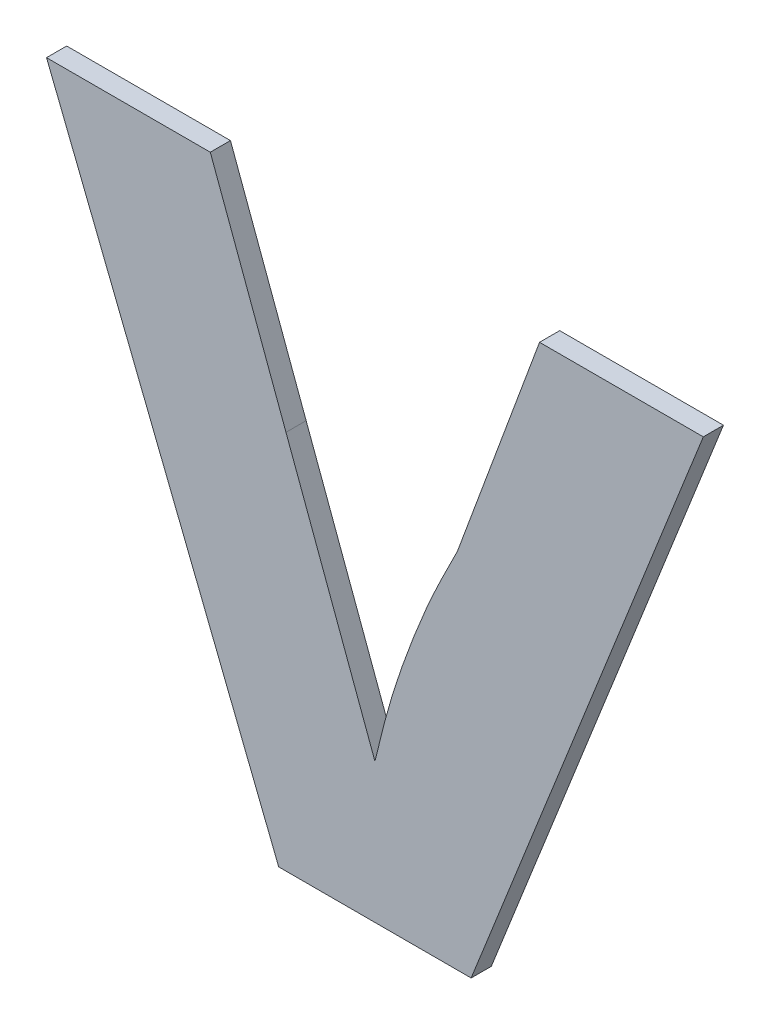
ISO-10303-21;
HEADER;
FILE_DESCRIPTION(('STEP AP214'),'2;1');
FILE_NAME('part.step','',(''),(''),'','','');
FILE_SCHEMA(('AUTOMOTIVE_DESIGN { 1 0 10303 214 1 1 1 1 }'));
ENDSEC;
DATA;
#1=APPLICATION_CONTEXT('core data for automotive mechanical design processes');
#2=APPLICATION_PROTOCOL_DEFINITION('international standard','automotive_design',2000,#1);
#3=PRODUCT_CONTEXT('',#1,'mechanical');
#4=PRODUCT('Part','Part','',(#3));
#5=PRODUCT_RELATED_PRODUCT_CATEGORY('part','',(#4));
#6=PRODUCT_DEFINITION_FORMATION('','',#4);
#7=PRODUCT_DEFINITION_CONTEXT('part definition',#1,'design');
#8=PRODUCT_DEFINITION('design','',#6,#7);
#9=PRODUCT_DEFINITION_SHAPE('','',#8);
#10=(LENGTH_UNIT() NAMED_UNIT(*) SI_UNIT(.MILLI.,.METRE.));
#11=(NAMED_UNIT(*) PLANE_ANGLE_UNIT() SI_UNIT($,.RADIAN.));
#12=(NAMED_UNIT(*) SI_UNIT($,.STERADIAN.) SOLID_ANGLE_UNIT());
#13=UNCERTAINTY_MEASURE_WITH_UNIT(LENGTH_MEASURE(1.E-05),#10,'distance_accuracy_value','');
#14=(GEOMETRIC_REPRESENTATION_CONTEXT(3) GLOBAL_UNCERTAINTY_ASSIGNED_CONTEXT((#13)) GLOBAL_UNIT_ASSIGNED_CONTEXT((#10,
#11,#12)) REPRESENTATION_CONTEXT('',''));
#15=CARTESIAN_POINT('',(0.,0.,0.));
#16=DIRECTION('',(0.,0.,1.));
#17=DIRECTION('',(1.,0.,0.));
#18=AXIS2_PLACEMENT_3D('',#15,#16,#17);
#19=CARTESIAN_POINT('',(2.57812499999897,-15.,0.5));
#20=DIRECTION('',(0.,1.,0.));
#21=DIRECTION('',(0.,0.,1.));
#22=AXIS2_PLACEMENT_3D('',#19,#20,#21);
#23=PLANE('',#22);
#24=DIRECTION('',(-1.,0.,0.));
#25=VECTOR('',#24,1.);
#26=CARTESIAN_POINT('',(2.57812499999897,-15.,1.));
#27=LINE('',#26,#25);
#28=CARTESIAN_POINT('',(2.57812499999897,-15.,1.));
#29=VERTEX_POINT('',#28);
#30=CARTESIAN_POINT('',(-2.19350961538565,-15.,1.));
#31=VERTEX_POINT('',#30);
#32=EDGE_CURVE('E129',#29,#31,#27,.T.);
#33=ORIENTED_EDGE('',*,*,#32,.T.);
#34=DIRECTION('',(0.,0.,1.));
#35=VECTOR('',#34,1.);
#36=CARTESIAN_POINT('',(-2.19350961538565,-15.,0.5));
#37=LINE('',#36,#35);
#38=CARTESIAN_POINT('',(-2.19350961538565,-15.,0.5));
#39=VERTEX_POINT('',#38);
#40=EDGE_CURVE('E142',#39,#31,#37,.T.);
#41=ORIENTED_EDGE('',*,*,#40,.F.);
#42=DIRECTION('',(-1.,0.,0.));
#43=VECTOR('',#42,1.);
#44=CARTESIAN_POINT('',(2.57812499999897,-15.,0.5));
#45=LINE('',#44,#43);
#46=CARTESIAN_POINT('',(2.57812499999897,-15.,0.5));
#47=VERTEX_POINT('',#46);
#48=EDGE_CURVE('E150',#47,#39,#45,.T.);
#49=ORIENTED_EDGE('',*,*,#48,.F.);
#50=DIRECTION('',(0.,0.,1.));
#51=VECTOR('',#50,1.);
#52=CARTESIAN_POINT('',(2.57812499999897,-15.,0.5));
#53=LINE('',#52,#51);
#54=EDGE_CURVE('E50',#47,#29,#53,.T.);
#55=ORIENTED_EDGE('',*,*,#54,.T.);
#56=EDGE_LOOP('',(#33,#41,#49,#55));
#57=FACE_BOUND('',#56,.T.);
#58=ADVANCED_FACE('F39',(#57),#23,.F.);
#59=CARTESIAN_POINT('',(0.192307692306661,-11.5384615384615,0.5));
#60=CARTESIAN_POINT('',(0.307335645135602,-11.0636630084768,0.5));
#61=CARTESIAN_POINT('',(0.538313239147836,-10.1102615143243,0.5));
#62=CARTESIAN_POINT('',(1.01580840379641,-8.7143568335504,0.5));
#63=CARTESIAN_POINT('',(1.57099503691416,-7.33434646211589,0.5));
#64=CARTESIAN_POINT('',(2.01692550513026,-6.44543318260047,0.5));
#65=CARTESIAN_POINT('',(2.24158653846051,-5.99759615384616,0.5));
#66=B_SPLINE_CURVE_WITH_KNOTS('',3,(#59,#60,#61,#62,#63,#64,#65),.UNSPECIFIED.,.F.,.F.,(4,1,1,1,
4),(0.,0.247288569234484,0.496558595921892,0.746364794238258,1.),.UNSPECIFIED.);
#67=DIRECTION('',(0.,0.,1.));
#68=VECTOR('',#67,1.);
#69=SURFACE_OF_LINEAR_EXTRUSION('',#66,#68);
#70=CARTESIAN_POINT('',(0.192307692306661,-11.5384615384615,1.));
#71=CARTESIAN_POINT('',(0.307335645135602,-11.0636630084768,1.));
#72=CARTESIAN_POINT('',(0.538313239147836,-10.1102615143243,1.));
#73=CARTESIAN_POINT('',(1.01580840379641,-8.7143568335504,1.));
#74=CARTESIAN_POINT('',(1.57099503691416,-7.33434646211589,1.));
#75=CARTESIAN_POINT('',(2.01692550513026,-6.44543318260047,1.));
#76=CARTESIAN_POINT('',(2.24158653846051,-5.99759615384616,1.));
#77=B_SPLINE_CURVE_WITH_KNOTS('',3,(#70,#71,#72,#73,#74,#75,#76),.UNSPECIFIED.,.F.,.F.,(4,1,1,1,
4),(0.,0.247288569234484,0.496558595921892,0.746364794238258,1.),.UNSPECIFIED.);
#78=CARTESIAN_POINT('',(0.192307692306661,-11.5384615384615,1.));
#79=VERTEX_POINT('',#78);
#80=CARTESIAN_POINT('',(2.24158653846051,-5.99759615384616,1.));
#81=VERTEX_POINT('',#80);
#82=EDGE_CURVE('E158',#79,#81,#77,.T.);
#83=ORIENTED_EDGE('',*,*,#82,.T.);
#84=DIRECTION('',(0.,0.,1.));
#85=VECTOR('',#84,1.);
#86=CARTESIAN_POINT('',(2.24158653846051,-5.99759615384616,0.5));
#87=LINE('',#86,#85);
#88=CARTESIAN_POINT('',(2.24158653846051,-5.99759615384616,0.5));
#89=VERTEX_POINT('',#88);
#90=EDGE_CURVE('E128',#89,#81,#87,.T.);
#91=ORIENTED_EDGE('',*,*,#90,.F.);
#92=CARTESIAN_POINT('',(0.192307692306661,-11.5384615384615,0.5));
#93=VERTEX_POINT('',#92);
#94=EDGE_CURVE('E156',#93,#89,#66,.T.);
#95=ORIENTED_EDGE('',*,*,#94,.F.);
#96=DIRECTION('',(0.,0.,1.));
#97=VECTOR('',#96,1.);
#98=CARTESIAN_POINT('',(0.192307692306661,-11.5384615384615,0.5));
#99=LINE('',#98,#97);
#100=EDGE_CURVE('E131',#93,#79,#99,.T.);
#101=ORIENTED_EDGE('',*,*,#100,.T.);
#102=EDGE_LOOP('',(#83,#91,#95,#101));
#103=FACE_BOUND('',#102,.T.);
#104=ADVANCED_FACE('F195',(#103),#69,.F.);
#105=CARTESIAN_POINT('',(-2.01322115384718,-5.57692307692308,0.5));
#106=CARTESIAN_POINT('',(-1.90148336291625,-5.88157387041414,0.5));
#107=CARTESIAN_POINT('',(-1.68301488396709,-6.47722369407848,0.5));
#108=CARTESIAN_POINT('',(-1.3572125629627,-7.34265260471597,0.5));
#109=CARTESIAN_POINT('',(-1.05956481259274,-8.1644994191939,0.5));
#110=CARTESIAN_POINT('',(-0.767696751157677,-8.93098003137535,0.5));
#111=CARTESIAN_POINT('',(-0.504222238858776,-9.65322834255941,0.5));
#112=CARTESIAN_POINT('',(-0.26137102747043,-10.3263658925396,0.5));
#113=CARTESIAN_POINT('',(-0.0211932285162089,-10.945714053131,0.5));
#114=CARTESIAN_POINT('',(0.122940847234858,-11.3458767813413,0.5));
#115=CARTESIAN_POINT('',(0.192307692306661,-11.5384615384615,0.5));
#116=B_SPLINE_CURVE_WITH_KNOTS('',3,(#105,#106,#107,#108,#109,#110,#111,#112,#113,#114,#115),
.UNSPECIFIED.,.F.,.F.,(4,1,1,1,1,1,1,1,4),(0.,0.153148108592632,0.299433468832907,
0.436426351456751,0.565670572956358,0.686508310287872,0.799268516063004,0.903394740801344,1.),.UNSPECIFIED.);
#117=DIRECTION('',(0.,0.,1.));
#118=VECTOR('',#117,1.);
#119=SURFACE_OF_LINEAR_EXTRUSION('',#116,#118);
#120=CARTESIAN_POINT('',(-2.01322115384718,-5.57692307692308,1.));
#121=CARTESIAN_POINT('',(-1.90148336291625,-5.88157387041414,1.));
#122=CARTESIAN_POINT('',(-1.68301488396709,-6.47722369407848,1.));
#123=CARTESIAN_POINT('',(-1.3572125629627,-7.34265260471597,1.));
#124=CARTESIAN_POINT('',(-1.05956481259274,-8.1644994191939,1.));
#125=CARTESIAN_POINT('',(-0.767696751157677,-8.93098003137535,1.));
#126=CARTESIAN_POINT('',(-0.504222238858776,-9.65322834255941,1.));
#127=CARTESIAN_POINT('',(-0.26137102747043,-10.3263658925396,1.));
#128=CARTESIAN_POINT('',(-0.0211932285162089,-10.945714053131,1.));
#129=CARTESIAN_POINT('',(0.122940847234858,-11.3458767813413,1.));
#130=CARTESIAN_POINT('',(0.192307692306661,-11.5384615384615,1.));
#131=B_SPLINE_CURVE_WITH_KNOTS('',3,(#120,#121,#122,#123,#124,#125,#126,#127,#128,#129,#130),
.UNSPECIFIED.,.F.,.F.,(4,1,1,1,1,1,1,1,4),(0.,0.153148108592632,0.299433468832907,
0.436426351456751,0.565670572956358,0.686508310287872,0.799268516063004,0.903394740801344,1.),.UNSPECIFIED.);
#132=CARTESIAN_POINT('',(-2.01322115384718,-5.57692307692308,1.));
#133=VERTEX_POINT('',#132);
#134=EDGE_CURVE('E163',#133,#79,#131,.T.);
#135=ORIENTED_EDGE('',*,*,#134,.T.);
#136=ORIENTED_EDGE('',*,*,#100,.F.);
#137=CARTESIAN_POINT('',(-2.01322115384718,-5.57692307692308,0.5));
#138=VERTEX_POINT('',#137);
#139=EDGE_CURVE('E181',#138,#93,#116,.T.);
#140=ORIENTED_EDGE('',*,*,#139,.F.);
#141=DIRECTION('',(0.,0.,1.));
#142=VECTOR('',#141,1.);
#143=CARTESIAN_POINT('',(-2.01322115384718,-5.57692307692308,0.5));
#144=LINE('',#143,#142);
#145=EDGE_CURVE('E153',#138,#133,#144,.T.);
#146=ORIENTED_EDGE('',*,*,#145,.T.);
#147=EDGE_LOOP('',(#135,#136,#140,#146));
#148=FACE_BOUND('',#147,.T.);
#149=ADVANCED_FACE('F198',(#148),#119,.F.);
#150=CARTESIAN_POINT('',(2.24158653846051,-5.99759615384616,0.5));
#151=DIRECTION('',(0.93793691795662,-0.346805908159069,0.));
#152=DIRECTION('',(0.346805908159069,0.93793691795662,0.));
#153=AXIS2_PLACEMENT_3D('',#150,#151,#152);
#154=PLANE('',#153);
#155=DIRECTION('',(0.346805908159069,0.93793691795662,0.));
#156=VECTOR('',#155,1.);
#157=CARTESIAN_POINT('',(2.24158653846051,-5.99759615384616,1.));
#158=LINE('',#157,#156);
#159=CARTESIAN_POINT('',(4.27434459534574,-0.5,1.));
#160=VERTEX_POINT('',#159);
#161=EDGE_CURVE('E121',#81,#160,#158,.T.);
#162=ORIENTED_EDGE('',*,*,#161,.T.);
#163=DIRECTION('',(0.,0.,-1.));
#164=VECTOR('',#163,1.);
#165=CARTESIAN_POINT('',(4.27434459534574,-0.5,0.5));
#166=LINE('',#165,#164);
#167=CARTESIAN_POINT('',(4.27434459534574,-0.5,0.5));
#168=VERTEX_POINT('',#167);
#169=EDGE_CURVE('E112',#160,#168,#166,.T.);
#170=ORIENTED_EDGE('',*,*,#169,.T.);
#171=DIRECTION('',(0.346805908159069,0.93793691795662,0.));
#172=VECTOR('',#171,1.);
#173=CARTESIAN_POINT('',(2.24158653846051,-5.99759615384616,0.5));
#174=LINE('',#173,#172);
#175=EDGE_CURVE('E162',#89,#168,#174,.T.);
#176=ORIENTED_EDGE('',*,*,#175,.F.);
#177=ORIENTED_EDGE('',*,*,#90,.T.);
#178=EDGE_LOOP('',(#162,#170,#176,#177));
#179=FACE_BOUND('',#178,.T.);
#180=ADVANCED_FACE('F199',(#179),#154,.F.);
#181=CARTESIAN_POINT('',(-4.92788461538565,2.30769230769231,0.5));
#182=DIRECTION('',(-0.937964174660869,-0.346732183468385,0.));
#183=DIRECTION('',(0.346732183468385,-0.937964174660869,0.));
#184=AXIS2_PLACEMENT_3D('',#181,#182,#183);
#185=PLANE('',#184);
#186=DIRECTION('',(0.346732183468385,-0.937964174660869,0.));
#187=VECTOR('',#186,1.);
#188=CARTESIAN_POINT('',(-4.92788461538565,2.30769230769231,0.5));
#189=LINE('',#188,#187);
#190=CARTESIAN_POINT('',(-3.88998006566707,-0.5,0.5));
#191=VERTEX_POINT('',#190);
#192=EDGE_CURVE('E300',#191,#138,#189,.T.);
#193=ORIENTED_EDGE('',*,*,#192,.F.);
#194=DIRECTION('',(0.,0.,1.));
#195=VECTOR('',#194,1.);
#196=CARTESIAN_POINT('',(-3.88998006566707,-0.5,0.5));
#197=LINE('',#196,#195);
#198=CARTESIAN_POINT('',(-3.88998006566707,-0.5,1.));
#199=VERTEX_POINT('',#198);
#200=EDGE_CURVE('E11',#191,#199,#197,.T.);
#201=ORIENTED_EDGE('',*,*,#200,.T.);
#202=DIRECTION('',(0.346732183468385,-0.937964174660869,0.));
#203=VECTOR('',#202,1.);
#204=CARTESIAN_POINT('',(-4.92788461538565,2.30769230769231,1.));
#205=LINE('',#204,#203);
#206=EDGE_CURVE('E175',#199,#133,#205,.T.);
#207=ORIENTED_EDGE('',*,*,#206,.T.);
#208=ORIENTED_EDGE('',*,*,#145,.F.);
#209=EDGE_LOOP('',(#193,#201,#207,#208));
#210=FACE_BOUND('',#209,.T.);
#211=ADVANCED_FACE('F205',(#210),#185,.F.);
#212=CARTESIAN_POINT('',(0.,0.,0.5));
#213=DIRECTION('',(0.,0.,-1.));
#214=DIRECTION('',(-1.,0.,0.));
#215=AXIS2_PLACEMENT_3D('',#212,#213,#214);
#216=PLANE('',#215);
#217=DIRECTION('',(-1.,0.,0.));
#218=VECTOR('',#217,1.);
#219=CARTESIAN_POINT('',(0.,-0.5,0.5));
#220=LINE('',#219,#218);
#221=CARTESIAN_POINT('',(8.33513621794769,-0.500000000000001,0.5));
#222=VERTEX_POINT('',#221);
#223=EDGE_CURVE('E53',#222,#168,#220,.T.);
#224=ORIENTED_EDGE('',*,*,#223,.F.);
#225=DIRECTION('',(-0.369014026975487,-0.929423825762679,0.));
#226=VECTOR('',#225,1.);
#227=CARTESIAN_POINT('',(14.4891826923067,15.,0.5));
#228=LINE('',#227,#226);
#229=EDGE_CURVE('E124',#222,#47,#228,.T.);
#230=ORIENTED_EDGE('',*,*,#229,.T.);
#231=ORIENTED_EDGE('',*,*,#48,.T.);
#232=DIRECTION('',(-0.369014026975487,0.929423825762679,0.));
#233=VECTOR('',#232,1.);
#234=CARTESIAN_POINT('',(-2.19350961538565,-15.,0.5));
#235=LINE('',#234,#233);
#236=CARTESIAN_POINT('',(-7.95052083333437,-0.5,0.5));
#237=VERTEX_POINT('',#236);
#238=EDGE_CURVE('E140',#39,#237,#235,.T.);
#239=ORIENTED_EDGE('',*,*,#238,.T.);
#240=EDGE_CURVE('E117',#191,#237,#220,.T.);
#241=ORIENTED_EDGE('',*,*,#240,.F.);
#242=ORIENTED_EDGE('',*,*,#192,.T.);
#243=ORIENTED_EDGE('',*,*,#139,.T.);
#244=ORIENTED_EDGE('',*,*,#94,.T.);
#245=ORIENTED_EDGE('',*,*,#175,.T.);
#246=EDGE_LOOP('',(#224,#230,#231,#239,#241,#242,#243,#244,#245));
#247=FACE_BOUND('',#246,.T.);
#248=ADVANCED_FACE('F202',(#247),#216,.T.);
#249=CARTESIAN_POINT('',(-2.19350961538565,-15.,0.5));
#250=DIRECTION('',(0.929423825762679,0.369014026975487,0.));
#251=DIRECTION('',(-0.369014026975487,0.929423825762679,0.));
#252=AXIS2_PLACEMENT_3D('',#249,#250,#251);
#253=PLANE('',#252);
#254=DIRECTION('',(-0.369014026975487,0.929423825762679,0.));
#255=VECTOR('',#254,1.);
#256=CARTESIAN_POINT('',(-2.19350961538565,-15.,1.));
#257=LINE('',#256,#255);
#258=CARTESIAN_POINT('',(-7.95052083333437,-0.5,1.));
#259=VERTEX_POINT('',#258);
#260=EDGE_CURVE('E135',#31,#259,#257,.T.);
#261=ORIENTED_EDGE('',*,*,#260,.T.);
#262=DIRECTION('',(0.,0.,-1.));
#263=VECTOR('',#262,1.);
#264=CARTESIAN_POINT('',(-7.95052083333437,-0.5,0.5));
#265=LINE('',#264,#263);
#266=EDGE_CURVE('E286',#259,#237,#265,.T.);
#267=ORIENTED_EDGE('',*,*,#266,.T.);
#268=ORIENTED_EDGE('',*,*,#238,.F.);
#269=ORIENTED_EDGE('',*,*,#40,.T.);
#270=EDGE_LOOP('',(#261,#267,#268,#269));
#271=FACE_BOUND('',#270,.T.);
#272=ADVANCED_FACE('F215',(#271),#253,.F.);
#273=CARTESIAN_POINT('',(14.4891826923067,15.,0.5));
#274=DIRECTION('',(-0.929423825762679,0.369014026975487,0.));
#275=DIRECTION('',(-0.369014026975487,-0.929423825762679,0.));
#276=AXIS2_PLACEMENT_3D('',#273,#274,#275);
#277=PLANE('',#276);
#278=ORIENTED_EDGE('',*,*,#229,.F.);
#279=DIRECTION('',(0.,0.,1.));
#280=VECTOR('',#279,1.);
#281=CARTESIAN_POINT('',(8.33513621794769,-0.499999999999999,0.5));
#282=LINE('',#281,#280);
#283=CARTESIAN_POINT('',(8.33513621794769,-0.5,1.));
#284=VERTEX_POINT('',#283);
#285=EDGE_CURVE('E109',#222,#284,#282,.T.);
#286=ORIENTED_EDGE('',*,*,#285,.T.);
#287=DIRECTION('',(-0.369014026975487,-0.929423825762679,0.));
#288=VECTOR('',#287,1.);
#289=CARTESIAN_POINT('',(14.4891826923067,15.,1.));
#290=LINE('',#289,#288);
#291=EDGE_CURVE('E122',#284,#29,#290,.T.);
#292=ORIENTED_EDGE('',*,*,#291,.T.);
#293=ORIENTED_EDGE('',*,*,#54,.F.);
#294=EDGE_LOOP('',(#278,#286,#292,#293));
#295=FACE_BOUND('',#294,.T.);
#296=ADVANCED_FACE('F41',(#295),#277,.F.);
#297=CARTESIAN_POINT('',(0.,0.,1.));
#298=DIRECTION('',(0.,0.,-1.));
#299=DIRECTION('',(-1.,0.,0.));
#300=AXIS2_PLACEMENT_3D('',#297,#298,#299);
#301=PLANE('',#300);
#302=ORIENTED_EDGE('',*,*,#291,.F.);
#303=DIRECTION('',(-1.,0.,0.));
#304=VECTOR('',#303,1.);
#305=CARTESIAN_POINT('',(-17.,-0.5,1.));
#306=LINE('',#305,#304);
#307=EDGE_CURVE('E110',#284,#160,#306,.T.);
#308=ORIENTED_EDGE('',*,*,#307,.T.);
#309=ORIENTED_EDGE('',*,*,#161,.F.);
#310=ORIENTED_EDGE('',*,*,#82,.F.);
#311=ORIENTED_EDGE('',*,*,#134,.F.);
#312=ORIENTED_EDGE('',*,*,#206,.F.);
#313=EDGE_CURVE('E65',#199,#259,#306,.T.);
#314=ORIENTED_EDGE('',*,*,#313,.T.);
#315=ORIENTED_EDGE('',*,*,#260,.F.);
#316=ORIENTED_EDGE('',*,*,#32,.F.);
#317=EDGE_LOOP('',(#302,#308,#309,#310,#311,#312,#314,#315,#316));
#318=FACE_BOUND('',#317,.T.);
#319=ADVANCED_FACE('F130',(#318),#301,.F.);
#320=CARTESIAN_POINT('',(-17.,-0.5,1.));
#321=DIRECTION('',(0.,-1.,0.));
#322=DIRECTION('',(0.,0.,-1.));
#323=AXIS2_PLACEMENT_3D('',#320,#321,#322);
#324=PLANE('',#323);
#325=ORIENTED_EDGE('',*,*,#313,.F.);
#326=ORIENTED_EDGE('',*,*,#200,.F.);
#327=ORIENTED_EDGE('',*,*,#240,.T.);
#328=ORIENTED_EDGE('',*,*,#266,.F.);
#329=EDGE_LOOP('',(#325,#326,#327,#328));
#330=FACE_BOUND('',#329,.T.);
#331=ADVANCED_FACE('F214',(#330),#324,.F.);
#332=ORIENTED_EDGE('',*,*,#223,.T.);
#333=ORIENTED_EDGE('',*,*,#169,.F.);
#334=ORIENTED_EDGE('',*,*,#307,.F.);
#335=ORIENTED_EDGE('',*,*,#285,.F.);
#336=EDGE_LOOP('',(#332,#333,#334,#335));
#337=FACE_BOUND('',#336,.T.);
#338=ADVANCED_FACE('F108',(#337),#324,.F.);
#339=CLOSED_SHELL('',(#58,#104,#149,#180,#211,#248,#272,#296,#319,#331,#338));
#340=MANIFOLD_SOLID_BREP('B2',#339);
#341=ADVANCED_BREP_SHAPE_REPRESENTATION('',(#18,#340),#14);
#342=SHAPE_DEFINITION_REPRESENTATION(#9,#341);
ENDSEC;
END-ISO-10303-21;
